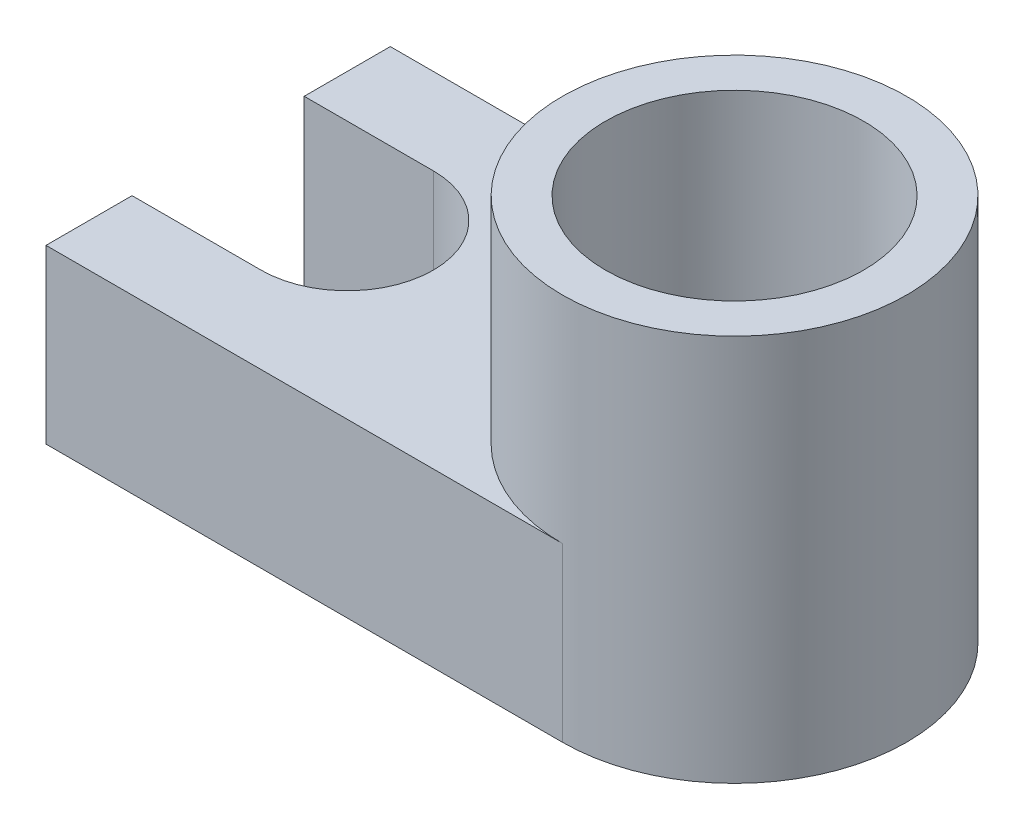
ISO-10303-21;
HEADER;
FILE_DESCRIPTION(('STEP AP214'),'2;1');
FILE_NAME('part.step','',(''),(''),'','','');
FILE_SCHEMA(('AUTOMOTIVE_DESIGN { 1 0 10303 214 1 1 1 1 }'));
ENDSEC;
DATA;
#1=APPLICATION_CONTEXT('core data for automotive mechanical design processes');
#2=APPLICATION_PROTOCOL_DEFINITION('international standard','automotive_design',2000,#1);
#3=PRODUCT_CONTEXT('',#1,'mechanical');
#4=PRODUCT('Part','Part','',(#3));
#5=PRODUCT_RELATED_PRODUCT_CATEGORY('part','',(#4));
#6=PRODUCT_DEFINITION_FORMATION('','',#4);
#7=PRODUCT_DEFINITION_CONTEXT('part definition',#1,'design');
#8=PRODUCT_DEFINITION('design','',#6,#7);
#9=PRODUCT_DEFINITION_SHAPE('','',#8);
#10=(LENGTH_UNIT() NAMED_UNIT(*) SI_UNIT(.MILLI.,.METRE.));
#11=(NAMED_UNIT(*) PLANE_ANGLE_UNIT() SI_UNIT($,.RADIAN.));
#12=(NAMED_UNIT(*) SI_UNIT($,.STERADIAN.) SOLID_ANGLE_UNIT());
#13=UNCERTAINTY_MEASURE_WITH_UNIT(LENGTH_MEASURE(1.E-05),#10,'distance_accuracy_value','');
#14=(GEOMETRIC_REPRESENTATION_CONTEXT(3) GLOBAL_UNCERTAINTY_ASSIGNED_CONTEXT((#13)) GLOBAL_UNIT_ASSIGNED_CONTEXT((#10,
#11,#12)) REPRESENTATION_CONTEXT('',''));
#15=CARTESIAN_POINT('',(0.,0.,0.));
#16=DIRECTION('',(0.,0.,1.));
#17=DIRECTION('',(1.,0.,0.));
#18=AXIS2_PLACEMENT_3D('',#15,#16,#17);
#19=CARTESIAN_POINT('',(0.,0.,0.));
#20=DIRECTION('',(0.,1.,0.));
#21=DIRECTION('',(0.,0.,1.));
#22=AXIS2_PLACEMENT_3D('',#19,#20,#21);
#23=PLANE('',#22);
#24=CARTESIAN_POINT('',(45.,0.,0.));
#25=DIRECTION('',(0.,1.,0.));
#26=DIRECTION('',(0.,0.,1.));
#27=AXIS2_PLACEMENT_3D('',#24,#25,#26);
#28=CIRCLE('',#27,15.);
#29=CARTESIAN_POINT('',(45.,0.,15.));
#30=VERTEX_POINT('',#29);
#31=EDGE_CURVE('E233',#30,#30,#28,.T.);
#32=ORIENTED_EDGE('',*,*,#31,.T.);
#33=EDGE_LOOP('',(#32));
#34=FACE_BOUND('',#33,.T.);
#35=DIRECTION('',(-1.,0.,0.));
#36=VECTOR('',#35,1.);
#37=CARTESIAN_POINT('',(-15.,0.,-20.));
#38=LINE('',#37,#36);
#39=CARTESIAN_POINT('',(45.,0.,-20.));
#40=VERTEX_POINT('',#39);
#41=CARTESIAN_POINT('',(-15.,0.,-20.));
#42=VERTEX_POINT('',#41);
#43=EDGE_CURVE('E164',#40,#42,#38,.T.);
#44=ORIENTED_EDGE('',*,*,#43,.F.);
#45=CARTESIAN_POINT('',(45.,0.,0.));
#46=DIRECTION('',(0.,1.,0.));
#47=DIRECTION('',(0.,0.,1.));
#48=AXIS2_PLACEMENT_3D('',#45,#46,#47);
#49=CIRCLE('',#48,20.);
#50=CARTESIAN_POINT('',(45.,0.,20.));
#51=VERTEX_POINT('',#50);
#52=EDGE_CURVE('E220',#51,#40,#49,.T.);
#53=ORIENTED_EDGE('',*,*,#52,.F.);
#54=DIRECTION('',(1.,0.,0.));
#55=VECTOR('',#54,1.);
#56=CARTESIAN_POINT('',(-15.,0.,20.));
#57=LINE('',#56,#55);
#58=CARTESIAN_POINT('',(-15.,0.,20.));
#59=VERTEX_POINT('',#58);
#60=EDGE_CURVE('E188',#59,#51,#57,.T.);
#61=ORIENTED_EDGE('',*,*,#60,.F.);
#62=DIRECTION('',(0.,0.,1.));
#63=VECTOR('',#62,1.);
#64=CARTESIAN_POINT('',(-15.,0.,20.));
#65=LINE('',#64,#63);
#66=CARTESIAN_POINT('',(-15.,0.,10.));
#67=VERTEX_POINT('',#66);
#68=EDGE_CURVE('E185',#67,#59,#65,.T.);
#69=ORIENTED_EDGE('',*,*,#68,.F.);
#70=DIRECTION('',(-1.,0.,0.));
#71=VECTOR('',#70,1.);
#72=CARTESIAN_POINT('',(0.,0.,10.));
#73=LINE('',#72,#71);
#74=CARTESIAN_POINT('',(0.,0.,10.));
#75=VERTEX_POINT('',#74);
#76=EDGE_CURVE('E181',#75,#67,#73,.T.);
#77=ORIENTED_EDGE('',*,*,#76,.F.);
#78=CARTESIAN_POINT('',(0.,0.,0.));
#79=DIRECTION('',(0.,-1.,0.));
#80=DIRECTION('',(0.,0.,1.));
#81=AXIS2_PLACEMENT_3D('',#78,#79,#80);
#82=CIRCLE('',#81,10.);
#83=CARTESIAN_POINT('',(0.,0.,-10.));
#84=VERTEX_POINT('',#83);
#85=EDGE_CURVE('E177',#84,#75,#82,.T.);
#86=ORIENTED_EDGE('',*,*,#85,.F.);
#87=DIRECTION('',(1.,0.,0.));
#88=VECTOR('',#87,1.);
#89=CARTESIAN_POINT('',(0.,0.,-10.));
#90=LINE('',#89,#88);
#91=CARTESIAN_POINT('',(-15.,0.,-10.));
#92=VERTEX_POINT('',#91);
#93=EDGE_CURVE('E129',#92,#84,#90,.T.);
#94=ORIENTED_EDGE('',*,*,#93,.F.);
#95=DIRECTION('',(0.,0.,1.));
#96=VECTOR('',#95,1.);
#97=CARTESIAN_POINT('',(-15.,0.,-10.));
#98=LINE('',#97,#96);
#99=EDGE_CURVE('E123',#42,#92,#98,.T.);
#100=ORIENTED_EDGE('',*,*,#99,.F.);
#101=EDGE_LOOP('',(#44,#53,#61,#69,#77,#86,#94,#100));
#102=FACE_BOUND('',#101,.T.);
#103=ADVANCED_FACE('F75',(#34,#102),#23,.F.);
#104=CARTESIAN_POINT('',(-15.,20.,20.));
#105=DIRECTION('',(0.,0.,-1.));
#106=DIRECTION('',(-1.,0.,0.));
#107=AXIS2_PLACEMENT_3D('',#104,#105,#106);
#108=PLANE('',#107);
#109=ORIENTED_EDGE('',*,*,#60,.T.);
#110=DIRECTION('',(0.,-1.,0.));
#111=VECTOR('',#110,1.);
#112=CARTESIAN_POINT('',(45.,20.,20.));
#113=LINE('',#112,#111);
#114=CARTESIAN_POINT('',(45.,20.,20.));
#115=VERTEX_POINT('',#114);
#116=EDGE_CURVE('E226',#115,#51,#113,.T.);
#117=ORIENTED_EDGE('',*,*,#116,.F.);
#118=DIRECTION('',(1.,0.,0.));
#119=VECTOR('',#118,1.);
#120=CARTESIAN_POINT('',(-15.,20.,20.));
#121=LINE('',#120,#119);
#122=CARTESIAN_POINT('',(-15.,20.,20.));
#123=VERTEX_POINT('',#122);
#124=EDGE_CURVE('E159',#123,#115,#121,.T.);
#125=ORIENTED_EDGE('',*,*,#124,.F.);
#126=DIRECTION('',(0.,-1.,0.));
#127=VECTOR('',#126,1.);
#128=CARTESIAN_POINT('',(-15.,20.,20.));
#129=LINE('',#128,#127);
#130=EDGE_CURVE('E204',#123,#59,#129,.T.);
#131=ORIENTED_EDGE('',*,*,#130,.T.);
#132=EDGE_LOOP('',(#109,#117,#125,#131));
#133=FACE_BOUND('',#132,.T.);
#134=ADVANCED_FACE('F224',(#133),#108,.F.);
#135=CARTESIAN_POINT('',(-15.,20.,20.));
#136=DIRECTION('',(1.,0.,0.));
#137=DIRECTION('',(0.,0.,-1.));
#138=AXIS2_PLACEMENT_3D('',#135,#136,#137);
#139=PLANE('',#138);
#140=ORIENTED_EDGE('',*,*,#68,.T.);
#141=ORIENTED_EDGE('',*,*,#130,.F.);
#142=DIRECTION('',(0.,0.,1.));
#143=VECTOR('',#142,1.);
#144=CARTESIAN_POINT('',(-15.,20.,20.));
#145=LINE('',#144,#143);
#146=CARTESIAN_POINT('',(-15.,20.,10.));
#147=VERTEX_POINT('',#146);
#148=EDGE_CURVE('E214',#147,#123,#145,.T.);
#149=ORIENTED_EDGE('',*,*,#148,.F.);
#150=DIRECTION('',(0.,-1.,0.));
#151=VECTOR('',#150,1.);
#152=CARTESIAN_POINT('',(-15.,20.,10.));
#153=LINE('',#152,#151);
#154=EDGE_CURVE('E85',#147,#67,#153,.T.);
#155=ORIENTED_EDGE('',*,*,#154,.T.);
#156=EDGE_LOOP('',(#140,#141,#149,#155));
#157=FACE_BOUND('',#156,.T.);
#158=ADVANCED_FACE('F212',(#157),#139,.F.);
#159=CARTESIAN_POINT('',(0.,20.,10.));
#160=DIRECTION('',(0.,0.,1.));
#161=DIRECTION('',(1.,0.,0.));
#162=AXIS2_PLACEMENT_3D('',#159,#160,#161);
#163=PLANE('',#162);
#164=ORIENTED_EDGE('',*,*,#76,.T.);
#165=ORIENTED_EDGE('',*,*,#154,.F.);
#166=DIRECTION('',(-1.,0.,0.));
#167=VECTOR('',#166,1.);
#168=CARTESIAN_POINT('',(0.,20.,10.));
#169=LINE('',#168,#167);
#170=CARTESIAN_POINT('',(0.,20.,10.));
#171=VERTEX_POINT('',#170);
#172=EDGE_CURVE('E137',#171,#147,#169,.T.);
#173=ORIENTED_EDGE('',*,*,#172,.F.);
#174=DIRECTION('',(0.,-1.,0.));
#175=VECTOR('',#174,1.);
#176=CARTESIAN_POINT('',(0.,20.,10.));
#177=LINE('',#176,#175);
#178=EDGE_CURVE('E11',#171,#75,#177,.T.);
#179=ORIENTED_EDGE('',*,*,#178,.T.);
#180=EDGE_LOOP('',(#164,#165,#173,#179));
#181=FACE_BOUND('',#180,.T.);
#182=ADVANCED_FACE('F248',(#181),#163,.F.);
#183=CARTESIAN_POINT('',(0.,20.,0.));
#184=DIRECTION('',(0.,-1.,0.));
#185=DIRECTION('',(0.,0.,-1.));
#186=AXIS2_PLACEMENT_3D('',#183,#184,#185);
#187=CYLINDRICAL_SURFACE('',#186,10.);
#188=ORIENTED_EDGE('',*,*,#85,.T.);
#189=ORIENTED_EDGE('',*,*,#178,.F.);
#190=CARTESIAN_POINT('',(0.,20.,0.));
#191=DIRECTION('',(0.,-1.,0.));
#192=DIRECTION('',(0.,0.,1.));
#193=AXIS2_PLACEMENT_3D('',#190,#191,#192);
#194=CIRCLE('',#193,10.);
#195=CARTESIAN_POINT('',(0.,20.,-10.));
#196=VERTEX_POINT('',#195);
#197=EDGE_CURVE('E197',#196,#171,#194,.T.);
#198=ORIENTED_EDGE('',*,*,#197,.F.);
#199=DIRECTION('',(0.,-1.,0.));
#200=VECTOR('',#199,1.);
#201=CARTESIAN_POINT('',(0.,20.,-10.));
#202=LINE('',#201,#200);
#203=EDGE_CURVE('E173',#196,#84,#202,.T.);
#204=ORIENTED_EDGE('',*,*,#203,.T.);
#205=EDGE_LOOP('',(#188,#189,#198,#204));
#206=FACE_BOUND('',#205,.T.);
#207=ADVANCED_FACE('F77',(#206),#187,.F.);
#208=CARTESIAN_POINT('',(0.,20.,-10.));
#209=DIRECTION('',(0.,0.,-1.));
#210=DIRECTION('',(-1.,0.,0.));
#211=AXIS2_PLACEMENT_3D('',#208,#209,#210);
#212=PLANE('',#211);
#213=ORIENTED_EDGE('',*,*,#93,.T.);
#214=ORIENTED_EDGE('',*,*,#203,.F.);
#215=DIRECTION('',(1.,0.,0.));
#216=VECTOR('',#215,1.);
#217=CARTESIAN_POINT('',(0.,20.,-10.));
#218=LINE('',#217,#216);
#219=CARTESIAN_POINT('',(-15.,20.,-10.));
#220=VERTEX_POINT('',#219);
#221=EDGE_CURVE('E93',#220,#196,#218,.T.);
#222=ORIENTED_EDGE('',*,*,#221,.F.);
#223=DIRECTION('',(0.,-1.,0.));
#224=VECTOR('',#223,1.);
#225=CARTESIAN_POINT('',(-15.,20.,-10.));
#226=LINE('',#225,#224);
#227=EDGE_CURVE('E167',#220,#92,#226,.T.);
#228=ORIENTED_EDGE('',*,*,#227,.T.);
#229=EDGE_LOOP('',(#213,#214,#222,#228));
#230=FACE_BOUND('',#229,.T.);
#231=ADVANCED_FACE('F253',(#230),#212,.F.);
#232=CARTESIAN_POINT('',(-15.,20.,-10.));
#233=DIRECTION('',(1.,0.,0.));
#234=DIRECTION('',(0.,0.,-1.));
#235=AXIS2_PLACEMENT_3D('',#232,#233,#234);
#236=PLANE('',#235);
#237=ORIENTED_EDGE('',*,*,#99,.T.);
#238=ORIENTED_EDGE('',*,*,#227,.F.);
#239=DIRECTION('',(0.,0.,1.));
#240=VECTOR('',#239,1.);
#241=CARTESIAN_POINT('',(-15.,20.,-10.));
#242=LINE('',#241,#240);
#243=CARTESIAN_POINT('',(-15.,20.,-20.));
#244=VERTEX_POINT('',#243);
#245=EDGE_CURVE('E152',#244,#220,#242,.T.);
#246=ORIENTED_EDGE('',*,*,#245,.F.);
#247=DIRECTION('',(0.,-1.,0.));
#248=VECTOR('',#247,1.);
#249=CARTESIAN_POINT('',(-15.,20.,-20.));
#250=LINE('',#249,#248);
#251=EDGE_CURVE('E161',#244,#42,#250,.T.);
#252=ORIENTED_EDGE('',*,*,#251,.T.);
#253=EDGE_LOOP('',(#237,#238,#246,#252));
#254=FACE_BOUND('',#253,.T.);
#255=ADVANCED_FACE('F169',(#254),#236,.F.);
#256=CARTESIAN_POINT('',(-15.,20.,-20.));
#257=DIRECTION('',(0.,0.,1.));
#258=DIRECTION('',(1.,0.,0.));
#259=AXIS2_PLACEMENT_3D('',#256,#257,#258);
#260=PLANE('',#259);
#261=ORIENTED_EDGE('',*,*,#43,.T.);
#262=ORIENTED_EDGE('',*,*,#251,.F.);
#263=DIRECTION('',(-1.,0.,0.));
#264=VECTOR('',#263,1.);
#265=CARTESIAN_POINT('',(-15.,20.,-20.));
#266=LINE('',#265,#264);
#267=CARTESIAN_POINT('',(45.,20.,-20.));
#268=VERTEX_POINT('',#267);
#269=EDGE_CURVE('E148',#268,#244,#266,.T.);
#270=ORIENTED_EDGE('',*,*,#269,.F.);
#271=DIRECTION('',(0.,-1.,0.));
#272=VECTOR('',#271,1.);
#273=CARTESIAN_POINT('',(45.,20.,-20.));
#274=LINE('',#273,#272);
#275=EDGE_CURVE('E166',#268,#40,#274,.T.);
#276=ORIENTED_EDGE('',*,*,#275,.T.);
#277=EDGE_LOOP('',(#261,#262,#270,#276));
#278=FACE_BOUND('',#277,.T.);
#279=ADVANCED_FACE('F162',(#278),#260,.F.);
#280=CARTESIAN_POINT('',(0.,20.,0.));
#281=DIRECTION('',(0.,1.,0.));
#282=DIRECTION('',(0.,0.,1.));
#283=AXIS2_PLACEMENT_3D('',#280,#281,#282);
#284=PLANE('',#283);
#285=CARTESIAN_POINT('',(45.,20.,0.));
#286=DIRECTION('',(0.,1.,0.));
#287=DIRECTION('',(0.,0.,1.));
#288=AXIS2_PLACEMENT_3D('',#285,#286,#287);
#289=CIRCLE('',#288,20.);
#290=EDGE_CURVE('E155',#268,#115,#289,.T.);
#291=ORIENTED_EDGE('',*,*,#290,.F.);
#292=ORIENTED_EDGE('',*,*,#269,.T.);
#293=ORIENTED_EDGE('',*,*,#245,.T.);
#294=ORIENTED_EDGE('',*,*,#221,.T.);
#295=ORIENTED_EDGE('',*,*,#197,.T.);
#296=ORIENTED_EDGE('',*,*,#172,.T.);
#297=ORIENTED_EDGE('',*,*,#148,.T.);
#298=ORIENTED_EDGE('',*,*,#124,.T.);
#299=EDGE_LOOP('',(#291,#292,#293,#294,#295,#296,#297,#298));
#300=FACE_BOUND('',#299,.T.);
#301=ADVANCED_FACE('F150',(#300),#284,.T.);
#302=CARTESIAN_POINT('',(45.,45.,0.));
#303=DIRECTION('',(0.,1.,0.));
#304=DIRECTION('',(0.,0.,1.));
#305=AXIS2_PLACEMENT_3D('',#302,#303,#304);
#306=PLANE('',#305);
#307=CARTESIAN_POINT('',(45.,45.,0.));
#308=DIRECTION('',(0.,1.,0.));
#309=DIRECTION('',(0.,0.,1.));
#310=AXIS2_PLACEMENT_3D('',#307,#308,#309);
#311=CIRCLE('',#310,20.);
#312=CARTESIAN_POINT('',(45.,45.,20.));
#313=VERTEX_POINT('',#312);
#314=EDGE_CURVE('E345',#313,#313,#311,.T.);
#315=ORIENTED_EDGE('',*,*,#314,.T.);
#316=EDGE_LOOP('',(#315));
#317=FACE_BOUND('',#316,.T.);
#318=CARTESIAN_POINT('',(45.,45.,0.));
#319=DIRECTION('',(0.,1.,0.));
#320=DIRECTION('',(0.,0.,1.));
#321=AXIS2_PLACEMENT_3D('',#318,#319,#320);
#322=CIRCLE('',#321,15.);
#323=CARTESIAN_POINT('',(45.,45.,15.));
#324=VERTEX_POINT('',#323);
#325=EDGE_CURVE('E182',#324,#324,#322,.T.);
#326=ORIENTED_EDGE('',*,*,#325,.F.);
#327=EDGE_LOOP('',(#326));
#328=FACE_BOUND('',#327,.T.);
#329=ADVANCED_FACE('F257',(#317,#328),#306,.T.);
#330=CARTESIAN_POINT('',(45.,0.,0.));
#331=DIRECTION('',(0.,1.,0.));
#332=DIRECTION('',(0.,0.,1.));
#333=AXIS2_PLACEMENT_3D('',#330,#331,#332);
#334=CYLINDRICAL_SURFACE('',#333,15.);
#335=ORIENTED_EDGE('',*,*,#325,.T.);
#336=EDGE_LOOP('',(#335));
#337=FACE_BOUND('',#336,.T.);
#338=ORIENTED_EDGE('',*,*,#31,.F.);
#339=EDGE_LOOP('',(#338));
#340=FACE_BOUND('',#339,.T.);
#341=ADVANCED_FACE('F263',(#337,#340),#334,.F.);
#342=CARTESIAN_POINT('',(45.,0.,0.));
#343=DIRECTION('',(0.,1.,0.));
#344=DIRECTION('',(0.,0.,1.));
#345=AXIS2_PLACEMENT_3D('',#342,#343,#344);
#346=CYLINDRICAL_SURFACE('',#345,20.);
#347=ORIENTED_EDGE('',*,*,#314,.F.);
#348=EDGE_LOOP('',(#347));
#349=FACE_BOUND('',#348,.T.);
#350=ORIENTED_EDGE('',*,*,#116,.T.);
#351=ORIENTED_EDGE('',*,*,#52,.T.);
#352=ORIENTED_EDGE('',*,*,#275,.F.);
#353=ORIENTED_EDGE('',*,*,#290,.T.);
#354=EDGE_LOOP('',(#350,#351,#352,#353));
#355=FACE_BOUND('',#354,.T.);
#356=ADVANCED_FACE('F228',(#349,#355),#346,.T.);
#357=CLOSED_SHELL('',(#103,#134,#158,#182,#207,#231,#255,#279,#301,#329,#341,#356));
#358=MANIFOLD_SOLID_BREP('B2',#357);
#359=ADVANCED_BREP_SHAPE_REPRESENTATION('',(#18,#358),#14);
#360=SHAPE_DEFINITION_REPRESENTATION(#9,#359);
ENDSEC;
END-ISO-10303-21;
